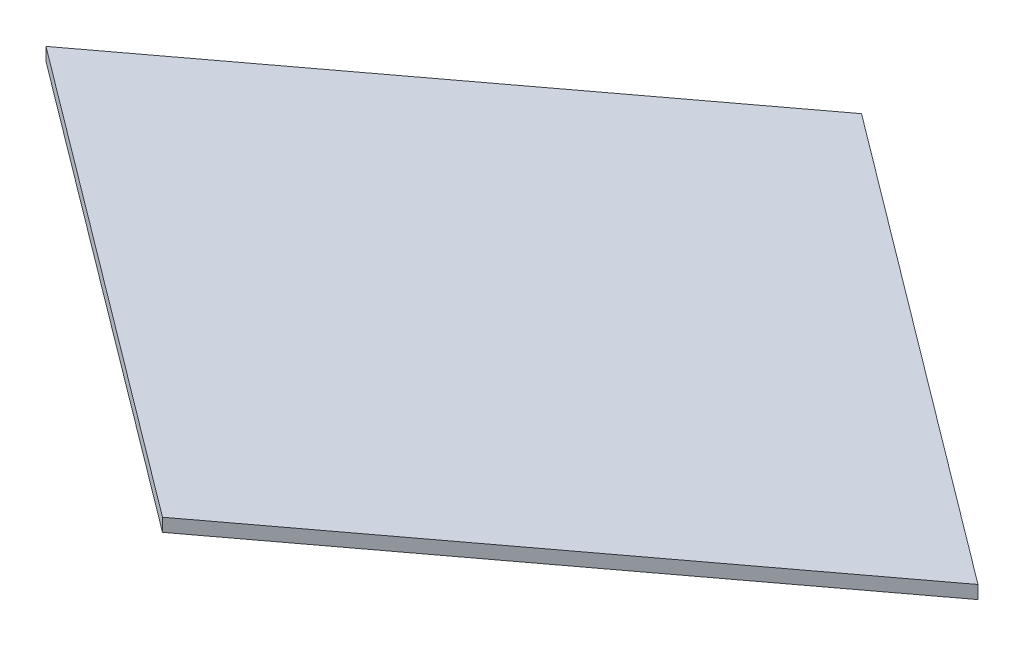
ISO-10303-21;
HEADER;
FILE_DESCRIPTION(('STEP AP214'),'2;1');
FILE_NAME('part.step','',(''),(''),'','','');
FILE_SCHEMA(('AUTOMOTIVE_DESIGN { 1 0 10303 214 1 1 1 1 }'));
ENDSEC;
DATA;
#1=APPLICATION_CONTEXT('core data for automotive mechanical design processes');
#2=APPLICATION_PROTOCOL_DEFINITION('international standard','automotive_design',2000,#1);
#3=PRODUCT_CONTEXT('',#1,'mechanical');
#4=PRODUCT('Part','Part','',(#3));
#5=PRODUCT_RELATED_PRODUCT_CATEGORY('part','',(#4));
#6=PRODUCT_DEFINITION_FORMATION('','',#4);
#7=PRODUCT_DEFINITION_CONTEXT('part definition',#1,'design');
#8=PRODUCT_DEFINITION('design','',#6,#7);
#9=PRODUCT_DEFINITION_SHAPE('','',#8);
#10=(LENGTH_UNIT() NAMED_UNIT(*) SI_UNIT(.MILLI.,.METRE.));
#11=(NAMED_UNIT(*) PLANE_ANGLE_UNIT() SI_UNIT($,.RADIAN.));
#12=(NAMED_UNIT(*) SI_UNIT($,.STERADIAN.) SOLID_ANGLE_UNIT());
#13=UNCERTAINTY_MEASURE_WITH_UNIT(LENGTH_MEASURE(1.E-05),#10,'distance_accuracy_value','');
#14=(GEOMETRIC_REPRESENTATION_CONTEXT(3) GLOBAL_UNCERTAINTY_ASSIGNED_CONTEXT((#13)) GLOBAL_UNIT_ASSIGNED_CONTEXT((#10,
#11,#12)) REPRESENTATION_CONTEXT('',''));
#15=CARTESIAN_POINT('',(0.,0.,0.));
#16=DIRECTION('',(0.,0.,1.));
#17=DIRECTION('',(1.,0.,0.));
#18=AXIS2_PLACEMENT_3D('',#15,#16,#17);
#19=CARTESIAN_POINT('',(-200.,5.63,0.));
#20=DIRECTION('',(0.6,0.,0.8));
#21=DIRECTION('',(0.8,0.,-0.6));
#22=AXIS2_PLACEMENT_3D('',#19,#20,#21);
#23=PLANE('',#22);
#24=DIRECTION('',(-0.8,0.,0.6));
#25=VECTOR('',#24,1.);
#26=CARTESIAN_POINT('',(-200.,0.,0.));
#27=LINE('',#26,#25);
#28=CARTESIAN_POINT('',(0.,0.,-150.));
#29=VERTEX_POINT('',#28);
#30=CARTESIAN_POINT('',(-200.,0.,0.));
#31=VERTEX_POINT('',#30);
#32=EDGE_CURVE('E96',#29,#31,#27,.T.);
#33=ORIENTED_EDGE('',*,*,#32,.T.);
#34=DIRECTION('',(0.,-1.,0.));
#35=VECTOR('',#34,1.);
#36=CARTESIAN_POINT('',(-200.,5.63,0.));
#37=LINE('',#36,#35);
#38=CARTESIAN_POINT('',(-200.,5.63,0.));
#39=VERTEX_POINT('',#38);
#40=EDGE_CURVE('E11',#39,#31,#37,.T.);
#41=ORIENTED_EDGE('',*,*,#40,.F.);
#42=DIRECTION('',(-0.8,0.,0.6));
#43=VECTOR('',#42,1.);
#44=CARTESIAN_POINT('',(-200.,5.63,0.));
#45=LINE('',#44,#43);
#46=CARTESIAN_POINT('',(0.,5.63,-150.));
#47=VERTEX_POINT('',#46);
#48=EDGE_CURVE('E84',#47,#39,#45,.T.);
#49=ORIENTED_EDGE('',*,*,#48,.F.);
#50=DIRECTION('',(0.,-1.,0.));
#51=VECTOR('',#50,1.);
#52=CARTESIAN_POINT('',(0.,5.63,-150.));
#53=LINE('',#52,#51);
#54=EDGE_CURVE('E92',#47,#29,#53,.T.);
#55=ORIENTED_EDGE('',*,*,#54,.T.);
#56=EDGE_LOOP('',(#33,#41,#49,#55));
#57=FACE_BOUND('',#56,.T.);
#58=ADVANCED_FACE('F33',(#57),#23,.F.);
#59=CARTESIAN_POINT('',(0.,5.63,150.));
#60=DIRECTION('',(0.6,0.,-0.8));
#61=DIRECTION('',(-0.8,0.,-0.6));
#62=AXIS2_PLACEMENT_3D('',#59,#60,#61);
#63=PLANE('',#62);
#64=DIRECTION('',(0.8,0.,0.6));
#65=VECTOR('',#64,1.);
#66=CARTESIAN_POINT('',(0.,0.,150.));
#67=LINE('',#66,#65);
#68=CARTESIAN_POINT('',(0.,0.,150.));
#69=VERTEX_POINT('',#68);
#70=EDGE_CURVE('E88',#31,#69,#67,.T.);
#71=ORIENTED_EDGE('',*,*,#70,.T.);
#72=DIRECTION('',(0.,-1.,0.));
#73=VECTOR('',#72,1.);
#74=CARTESIAN_POINT('',(0.,5.63,150.));
#75=LINE('',#74,#73);
#76=CARTESIAN_POINT('',(0.,5.63,150.));
#77=VERTEX_POINT('',#76);
#78=EDGE_CURVE('E41',#77,#69,#75,.T.);
#79=ORIENTED_EDGE('',*,*,#78,.F.);
#80=DIRECTION('',(0.8,0.,0.6));
#81=VECTOR('',#80,1.);
#82=CARTESIAN_POINT('',(0.,5.63,150.));
#83=LINE('',#82,#81);
#84=EDGE_CURVE('E79',#39,#77,#83,.T.);
#85=ORIENTED_EDGE('',*,*,#84,.F.);
#86=ORIENTED_EDGE('',*,*,#40,.T.);
#87=EDGE_LOOP('',(#71,#79,#85,#86));
#88=FACE_BOUND('',#87,.T.);
#89=ADVANCED_FACE('F87',(#88),#63,.F.);
#90=CARTESIAN_POINT('',(200.,5.63,0.));
#91=DIRECTION('',(-0.6,0.,-0.8));
#92=DIRECTION('',(-0.8,0.,0.6));
#93=AXIS2_PLACEMENT_3D('',#90,#91,#92);
#94=PLANE('',#93);
#95=DIRECTION('',(0.8,0.,-0.6));
#96=VECTOR('',#95,1.);
#97=CARTESIAN_POINT('',(200.,0.,0.));
#98=LINE('',#97,#96);
#99=CARTESIAN_POINT('',(200.,0.,0.));
#100=VERTEX_POINT('',#99);
#101=EDGE_CURVE('E66',#69,#100,#98,.T.);
#102=ORIENTED_EDGE('',*,*,#101,.T.);
#103=DIRECTION('',(0.,-1.,0.));
#104=VECTOR('',#103,1.);
#105=CARTESIAN_POINT('',(200.,5.63,0.));
#106=LINE('',#105,#104);
#107=CARTESIAN_POINT('',(200.,5.63,0.));
#108=VERTEX_POINT('',#107);
#109=EDGE_CURVE('E89',#108,#100,#106,.T.);
#110=ORIENTED_EDGE('',*,*,#109,.F.);
#111=DIRECTION('',(0.8,0.,-0.6));
#112=VECTOR('',#111,1.);
#113=CARTESIAN_POINT('',(200.,5.63,0.));
#114=LINE('',#113,#112);
#115=EDGE_CURVE('E82',#77,#108,#114,.T.);
#116=ORIENTED_EDGE('',*,*,#115,.F.);
#117=ORIENTED_EDGE('',*,*,#78,.T.);
#118=EDGE_LOOP('',(#102,#110,#116,#117));
#119=FACE_BOUND('',#118,.T.);
#120=ADVANCED_FACE('F90',(#119),#94,.F.);
#121=CARTESIAN_POINT('',(0.,5.63,-150.));
#122=DIRECTION('',(-0.6,0.,0.8));
#123=DIRECTION('',(0.8,0.,0.6));
#124=AXIS2_PLACEMENT_3D('',#121,#122,#123);
#125=PLANE('',#124);
#126=DIRECTION('',(-0.8,0.,-0.6));
#127=VECTOR('',#126,1.);
#128=CARTESIAN_POINT('',(0.,0.,-150.));
#129=LINE('',#128,#127);
#130=EDGE_CURVE('E72',#100,#29,#129,.T.);
#131=ORIENTED_EDGE('',*,*,#130,.T.);
#132=ORIENTED_EDGE('',*,*,#54,.F.);
#133=DIRECTION('',(-0.8,0.,-0.6));
#134=VECTOR('',#133,1.);
#135=CARTESIAN_POINT('',(0.,5.63,-150.));
#136=LINE('',#135,#134);
#137=EDGE_CURVE('E49',#108,#47,#136,.T.);
#138=ORIENTED_EDGE('',*,*,#137,.F.);
#139=ORIENTED_EDGE('',*,*,#109,.T.);
#140=EDGE_LOOP('',(#131,#132,#138,#139));
#141=FACE_BOUND('',#140,.T.);
#142=ADVANCED_FACE('F103',(#141),#125,.F.);
#143=CARTESIAN_POINT('',(0.,5.63,0.));
#144=DIRECTION('',(0.,-1.,0.));
#145=DIRECTION('',(0.,0.,-1.));
#146=AXIS2_PLACEMENT_3D('',#143,#144,#145);
#147=PLANE('',#146);
#148=ORIENTED_EDGE('',*,*,#48,.T.);
#149=ORIENTED_EDGE('',*,*,#84,.T.);
#150=ORIENTED_EDGE('',*,*,#115,.T.);
#151=ORIENTED_EDGE('',*,*,#137,.T.);
#152=EDGE_LOOP('',(#148,#149,#150,#151));
#153=FACE_BOUND('',#152,.T.);
#154=ADVANCED_FACE('F80',(#153),#147,.F.);
#155=CARTESIAN_POINT('',(0.,0.,0.));
#156=DIRECTION('',(0.,-1.,0.));
#157=DIRECTION('',(0.,0.,-1.));
#158=AXIS2_PLACEMENT_3D('',#155,#156,#157);
#159=PLANE('',#158);
#160=ORIENTED_EDGE('',*,*,#32,.F.);
#161=ORIENTED_EDGE('',*,*,#130,.F.);
#162=ORIENTED_EDGE('',*,*,#101,.F.);
#163=ORIENTED_EDGE('',*,*,#70,.F.);
#164=EDGE_LOOP('',(#160,#161,#162,#163));
#165=FACE_BOUND('',#164,.T.);
#166=ADVANCED_FACE('F106',(#165),#159,.T.);
#167=CLOSED_SHELL('',(#58,#89,#120,#142,#154,#166));
#168=MANIFOLD_SOLID_BREP('B2',#167);
#169=ADVANCED_BREP_SHAPE_REPRESENTATION('',(#18,#168),#14);
#170=SHAPE_DEFINITION_REPRESENTATION(#9,#169);
ENDSEC;
END-ISO-10303-21;
